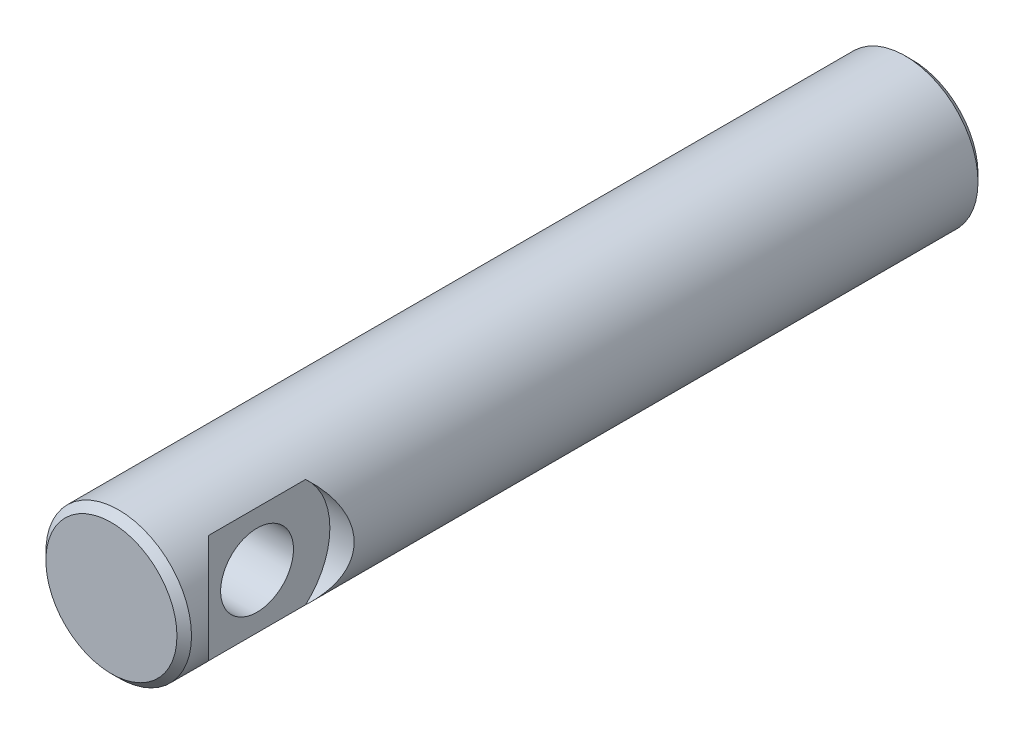
ISO-10303-21;
HEADER;
FILE_DESCRIPTION(('STEP AP214'),'2;1');
FILE_NAME('part.step','',(''),(''),'','','');
FILE_SCHEMA(('AUTOMOTIVE_DESIGN { 1 0 10303 214 1 1 1 1 }'));
ENDSEC;
DATA;
#1=APPLICATION_CONTEXT('core data for automotive mechanical design processes');
#2=APPLICATION_PROTOCOL_DEFINITION('international standard','automotive_design',2000,#1);
#3=PRODUCT_CONTEXT('',#1,'mechanical');
#4=PRODUCT('Part','Part','',(#3));
#5=PRODUCT_RELATED_PRODUCT_CATEGORY('part','',(#4));
#6=PRODUCT_DEFINITION_FORMATION('','',#4);
#7=PRODUCT_DEFINITION_CONTEXT('part definition',#1,'design');
#8=PRODUCT_DEFINITION('design','',#6,#7);
#9=PRODUCT_DEFINITION_SHAPE('','',#8);
#10=(LENGTH_UNIT() NAMED_UNIT(*) SI_UNIT(.MILLI.,.METRE.));
#11=(NAMED_UNIT(*) PLANE_ANGLE_UNIT() SI_UNIT($,.RADIAN.));
#12=(NAMED_UNIT(*) SI_UNIT($,.STERADIAN.) SOLID_ANGLE_UNIT());
#13=UNCERTAINTY_MEASURE_WITH_UNIT(LENGTH_MEASURE(1.E-05),#10,'distance_accuracy_value','');
#14=(GEOMETRIC_REPRESENTATION_CONTEXT(3) GLOBAL_UNCERTAINTY_ASSIGNED_CONTEXT((#13)) GLOBAL_UNIT_ASSIGNED_CONTEXT((#10,
#11,#12)) REPRESENTATION_CONTEXT('',''));
#15=CARTESIAN_POINT('',(0.,0.,0.));
#16=DIRECTION('',(0.,0.,1.));
#17=DIRECTION('',(1.,0.,0.));
#18=AXIS2_PLACEMENT_3D('',#15,#16,#17);
#19=CARTESIAN_POINT('',(0.,0.,-33.));
#20=DIRECTION('',(0.,0.,1.));
#21=DIRECTION('',(-1.,0.,0.));
#22=AXIS2_PLACEMENT_3D('',#19,#20,#21);
#23=CYLINDRICAL_SURFACE('',#22,3.);
#24=CARTESIAN_POINT('',(0.,0.,-0.300000000000002));
#25=DIRECTION('',(0.,0.,1.));
#26=DIRECTION('',(1.,0.,0.));
#27=AXIS2_PLACEMENT_3D('',#24,#25,#26);
#28=CIRCLE('',#27,3.);
#29=CARTESIAN_POINT('',(3.,0.,-0.300000000000002));
#30=VERTEX_POINT('',#29);
#31=EDGE_CURVE('E80',#30,#30,#28,.T.);
#32=ORIENTED_EDGE('',*,*,#31,.F.);
#33=EDGE_LOOP('',(#32));
#34=FACE_BOUND('',#33,.T.);
#35=CARTESIAN_POINT('',(0.,0.,-32.7));
#36=DIRECTION('',(0.,0.,1.));
#37=DIRECTION('',(1.,0.,0.));
#38=AXIS2_PLACEMENT_3D('',#35,#36,#37);
#39=CIRCLE('',#38,3.);
#40=CARTESIAN_POINT('',(3.,0.,-32.7));
#41=VERTEX_POINT('',#40);
#42=EDGE_CURVE('E77',#41,#41,#39,.F.);
#43=ORIENTED_EDGE('',*,*,#42,.F.);
#44=EDGE_LOOP('',(#43));
#45=FACE_BOUND('',#44,.T.);
#46=CARTESIAN_POINT('',(0.,0.,-4.00000000000001));
#47=DIRECTION('',(0.707106781186548,0.,-0.707106781186547));
#48=DIRECTION('',(0.707106781186547,0.,0.707106781186548));
#49=AXIS2_PLACEMENT_3D('',#46,#47,#48);
#50=ELLIPSE('',#49,4.24264068711929,3.);
#51=CARTESIAN_POINT('',(2.,-2.2360679774998,-2.00000000000001));
#52=VERTEX_POINT('',#51);
#53=CARTESIAN_POINT('',(2.,2.2360679774998,-2.00000000000001));
#54=VERTEX_POINT('',#53);
#55=EDGE_CURVE('E64',#52,#54,#50,.F.);
#56=ORIENTED_EDGE('',*,*,#55,.T.);
#57=DIRECTION('',(0.,0.,1.));
#58=VECTOR('',#57,1.);
#59=CARTESIAN_POINT('',(2.00000000000002,2.23606797749977,-33.));
#60=LINE('',#59,#58);
#61=CARTESIAN_POINT('',(2.,2.23606797749979,-6.00000000000001));
#62=VERTEX_POINT('',#61);
#63=EDGE_CURVE('E69',#54,#62,#60,.F.);
#64=ORIENTED_EDGE('',*,*,#63,.T.);
#65=CARTESIAN_POINT('',(0.,0.,-4.00000000000001));
#66=DIRECTION('',(-0.707106781186547,0.,-0.707106781186548));
#67=DIRECTION('',(-0.707106781186548,0.,0.707106781186547));
#68=AXIS2_PLACEMENT_3D('',#65,#66,#67);
#69=ELLIPSE('',#68,4.24264068711929,3.);
#70=CARTESIAN_POINT('',(2.,-2.23606797749979,-6.00000000000001));
#71=VERTEX_POINT('',#70);
#72=EDGE_CURVE('E74',#62,#71,#69,.T.);
#73=ORIENTED_EDGE('',*,*,#72,.T.);
#74=DIRECTION('',(0.,0.,1.));
#75=VECTOR('',#74,1.);
#76=CARTESIAN_POINT('',(2.00000000000002,-2.23606797749977,-33.));
#77=LINE('',#76,#75);
#78=EDGE_CURVE('E73',#71,#52,#77,.T.);
#79=ORIENTED_EDGE('',*,*,#78,.T.);
#80=EDGE_LOOP('',(#56,#64,#73,#79));
#81=FACE_BOUND('',#80,.T.);
#82=CARTESIAN_POINT('',(-3.,0.,-5.50000000000002));
#83=CARTESIAN_POINT('',(-2.99999570107562,0.0788579444268507,-5.49999504652423));
#84=CARTESIAN_POINT('',(-2.99685736529635,0.157809899546345,-5.49374489031844));
#85=CARTESIAN_POINT('',(-2.98461234055735,0.313380352903346,-5.46902067948771));
#86=CARTESIAN_POINT('',(-2.97549431743379,0.389994130070447,-5.4505234105033));
#87=CARTESIAN_POINT('',(-2.95224419105063,0.538400317320677,-5.40220928707508));
#88=CARTESIAN_POINT('',(-2.93813158766306,0.610210204408723,-5.37243642362807));
#89=CARTESIAN_POINT('',(-2.90618664773642,0.747708925209902,-5.30264406795254));
#90=CARTESIAN_POINT('',(-2.88835460450288,0.813398240985093,-5.26262538362672));
#91=CARTESIAN_POINT('',(-2.84934387387093,0.941261726642869,-5.17072412577209));
#92=CARTESIAN_POINT('',(-2.82802798691305,1.00298281668317,-5.11827028114056));
#93=CARTESIAN_POINT('',(-2.78489955370114,1.11716916730048,-5.00421778112946));
#94=CARTESIAN_POINT('',(-2.76308664313552,1.16962737466016,-4.94261222234136));
#95=CARTESIAN_POINT('',(-2.71948426796021,1.26787800067542,-4.80627497571495));
#96=CARTESIAN_POINT('',(-2.69782780455197,1.31283800332746,-4.73089585248115));
#97=CARTESIAN_POINT('',(-2.6592896815848,1.38925234033605,-4.57244899602069));
#98=CARTESIAN_POINT('',(-2.64240461410484,1.42071632244951,-4.48938680691589));
#99=CARTESIAN_POINT('',(-2.61686800556712,1.46719866328289,-4.32300234186713));
#100=CARTESIAN_POINT('',(-2.6077840737557,1.48308878562067,-4.23999332189892));
#101=CARTESIAN_POINT('',(-2.59772834922791,1.50064048996328,-4.0720317433308));
#102=CARTESIAN_POINT('',(-2.59674854014931,1.50231613255962,-3.98708118869328));
#103=CARTESIAN_POINT('',(-2.60266395385872,1.49203093075845,-3.82857096352696));
#104=CARTESIAN_POINT('',(-2.6086314549302,1.48167683930524,-3.75486395316543));
#105=CARTESIAN_POINT('',(-2.62614343100775,1.45040977358541,-3.61041713594045));
#106=CARTESIAN_POINT('',(-2.63768968247664,1.42949343584649,-3.53967828204203));
#107=CARTESIAN_POINT('',(-2.66531214619111,1.37731467057902,-3.40115630115152));
#108=CARTESIAN_POINT('',(-2.68148760995997,1.345822600674,-3.33348040182132));
#109=CARTESIAN_POINT('',(-2.71655106422105,1.27356253150201,-3.20404856111499));
#110=CARTESIAN_POINT('',(-2.73544027170285,1.23279036571871,-3.14229529659987));
#111=CARTESIAN_POINT('',(-2.77669736854928,1.13709908236919,-3.01821812088517));
#112=CARTESIAN_POINT('',(-2.79920265355119,1.08104168755393,-2.95681468963577));
#113=CARTESIAN_POINT('',(-2.8432143495061,0.959333368112069,-2.84389687211365));
#114=CARTESIAN_POINT('',(-2.86472027938201,0.893677884861437,-2.79238721194918));
#115=CARTESIAN_POINT('',(-2.90552980924446,0.750774758747781,-2.69847150845541));
#116=CARTESIAN_POINT('',(-2.92468476243011,0.673130387399121,-2.65659929133139));
#117=CARTESIAN_POINT('',(-2.95736821681863,0.510699323233201,-2.58685445643549));
#118=CARTESIAN_POINT('',(-2.9709011841533,0.425918364397919,-2.55897072247725));
#119=CARTESIAN_POINT('',(-2.98986500612153,0.259149737491058,-2.52028689442499));
#120=CARTESIAN_POINT('',(-2.99587407451965,0.177512295822493,-2.50826314637983));
#121=CARTESIAN_POINT('',(-3.00109520188655,0.01316939992403,-2.49780290329827));
#122=CARTESIAN_POINT('',(-3.00031048081978,-0.0695355298048611,-2.4993599715408));
#123=CARTESIAN_POINT('',(-2.99236788380152,-0.226849457978979,-2.51531003262812));
#124=CARTESIAN_POINT('',(-2.98570868532252,-0.301589112074895,-2.52869879909499));
#125=CARTESIAN_POINT('',(-2.9673325697226,-0.447610338452912,-2.56635710784268));
#126=CARTESIAN_POINT('',(-2.95561509501618,-0.518891528536631,-2.59062784968024));
#127=CARTESIAN_POINT('',(-2.92776377120382,-0.658332912674361,-2.64999769964955));
#128=CARTESIAN_POINT('',(-2.91151322654446,-0.726345595508707,-2.68538657517443));
#129=CARTESIAN_POINT('',(-2.87615961476126,-0.85569204254891,-2.76566130346985));
#130=CARTESIAN_POINT('',(-2.85705533350407,-0.917022944664891,-2.81055120189309));
#131=CARTESIAN_POINT('',(-2.81562332004297,-1.03765153393383,-2.91364063799607));
#132=CARTESIAN_POINT('',(-2.79316327265249,-1.09615811672855,-2.97271430266772));
#133=CARTESIAN_POINT('',(-2.7489358741323,-1.20278448167829,-3.09988772691659));
#134=CARTESIAN_POINT('',(-2.7271690110007,-1.25089707856782,-3.16799367827188));
#135=CARTESIAN_POINT('',(-2.68576788309734,-1.33756187171853,-3.31546548125947));
#136=CARTESIAN_POINT('',(-2.66628794383591,-1.37553824370038,-3.39521689914172));
#137=CARTESIAN_POINT('',(-2.63361108441201,-1.43712423890206,-3.56126510136245));
#138=CARTESIAN_POINT('',(-2.62040607332624,-1.46075237380053,-3.64755328970034));
#139=CARTESIAN_POINT('',(-2.60342251538702,-1.49079253120032,-3.81536533432706));
#140=CARTESIAN_POINT('',(-2.59886075197597,-1.49863949460819,-3.89655138015287));
#141=CARTESIAN_POINT('',(-2.59748031962404,-1.50103373156431,-4.05917060074679));
#142=CARTESIAN_POINT('',(-2.60065829439584,-1.49558676993487,-4.1406036531068));
#143=CARTESIAN_POINT('',(-2.61356793076614,-1.47288918838998,-4.29322525230016));
#144=CARTESIAN_POINT('',(-2.62264641723987,-1.45681247151456,-4.36465070521712));
#145=CARTESIAN_POINT('',(-2.64556524281478,-1.41476303733663,-4.50371217913656));
#146=CARTESIAN_POINT('',(-2.65940711354502,-1.38878713673989,-4.57134697313806));
#147=CARTESIAN_POINT('',(-2.69142795546803,-1.32572361795086,-4.70593727647982));
#148=CARTESIAN_POINT('',(-2.7098358359388,-1.28800670672356,-4.77254185274355));
#149=CARTESIAN_POINT('',(-2.7485299745229,-1.2032264574561,-4.8989118042719));
#150=CARTESIAN_POINT('',(-2.76881720693415,-1.15615825686235,-4.95867359578168));
#151=CARTESIAN_POINT('',(-2.81193484737138,-1.04730498999207,-5.07721297353203));
#152=CARTESIAN_POINT('',(-2.83477474959942,-0.984426634495904,-5.13498865352545));
#153=CARTESIAN_POINT('',(-2.87816628389896,-0.849232209349807,-5.23939447515292));
#154=CARTESIAN_POINT('',(-2.89871667939292,-0.776911084957807,-5.28601860920488));
#155=CARTESIAN_POINT('',(-2.93547014349806,-0.623897395174429,-5.36685454406812));
#156=CARTESIAN_POINT('',(-2.95164144740899,-0.543149255665106,-5.40097625385472));
#157=CARTESIAN_POINT('',(-2.9775201194848,-0.376113151707138,-5.45471225163613));
#158=CARTESIAN_POINT('',(-2.98724585044602,-0.289841699383657,-5.47436777020859));
#159=CARTESIAN_POINT('',(-2.99543192870217,-0.168902919736348,-5.49084611662863));
#160=CARTESIAN_POINT('',(-2.99714048010376,-0.135242819162352,-5.49427396129953));
#161=CARTESIAN_POINT('',(-2.99942545465223,-0.0677275977076401,-5.49885199827115));
#162=CARTESIAN_POINT('',(-3.00000184655071,-0.033872471469944,-5.50000212770533));
#163=CARTESIAN_POINT('',(-3.,0.,-5.50000000000002));
#164=B_SPLINE_CURVE_WITH_KNOTS('',3,(#82,#83,#84,#85,#86,#87,#88,#89,#90,#91,#92,#93,#94,#95,
#96,#97,#98,#99,#100,#101,#102,#103,#104,#105,#106,#107,#108,#109,#110,#111,#112,#113,#114,#115,
#116,#117,#118,#119,#120,#121,#122,#123,#124,#125,#126,#127,#128,#129,#130,#131,#132,#133,#134,
#135,#136,#137,#138,#139,#140,#141,#142,#143,#144,#145,#146,#147,#148,#149,#150,#151,#152,#153,
#154,#155,#156,#157,#158,#159,#160,#161,#162,#163),.UNSPECIFIED.,.T.,.F.,(4,2,2,2,2,2,2,2,2,2,2,
2,2,2,2,2,2,2,2,2,2,2,2,2,2,2,2,2,2,2,2,2,2,2,2,2,2,2,2,2,4),(0.,0.23643638613044,
0.473322224563799,0.709293233238452,0.945245640872357,1.19547263807714,1.44588935648106,
1.7157258964613,1.98536921847423,2.23887018210346,2.49212035993532,2.71508568613983,
2.9381220588852,3.16635360252733,3.39468781890335,3.6519741200082,3.90938301898032,
4.17874533321664,4.44789325368422,4.69474935707022,4.94148846767217,5.16910359759186,
5.39674382446401,5.63089284041852,5.86514176122513,6.12239415966632,6.37982382923152,
6.64972023242593,6.91926767918181,7.16293961254575,7.40650589797023,7.62686895373289,
7.84730293182532,8.08254685170436,8.31791341715452,8.58187864135763,8.84598575071874,
9.11196020495296,9.3771736293173,9.47872920200882,9.58028757766606),.UNSPECIFIED.);
#165=CARTESIAN_POINT('',(-3.,0.,-5.50000000000002));
#166=VERTEX_POINT('',#165);
#167=EDGE_CURVE('E84',#166,#166,#164,.T.);
#168=ORIENTED_EDGE('',*,*,#167,.T.);
#169=EDGE_LOOP('',(#168));
#170=FACE_BOUND('',#169,.T.);
#171=ADVANCED_FACE('F35',(#34,#45,#81,#170),#23,.T.);
#172=CARTESIAN_POINT('',(0.,0.,-33.));
#173=DIRECTION('',(0.,0.,-1.));
#174=DIRECTION('',(1.,0.,0.));
#175=AXIS2_PLACEMENT_3D('',#172,#173,#174);
#176=PLANE('',#175);
#177=CARTESIAN_POINT('',(0.,0.,-33.));
#178=DIRECTION('',(0.,0.,1.));
#179=DIRECTION('',(1.,0.,0.));
#180=AXIS2_PLACEMENT_3D('',#177,#178,#179);
#181=CIRCLE('',#180,2.7);
#182=CARTESIAN_POINT('',(2.7,0.,-33.));
#183=VERTEX_POINT('',#182);
#184=EDGE_CURVE('E11',#183,#183,#181,.T.);
#185=ORIENTED_EDGE('',*,*,#184,.F.);
#186=EDGE_LOOP('',(#185));
#187=FACE_BOUND('',#186,.T.);
#188=ADVANCED_FACE('F99',(#187),#176,.T.);
#189=CARTESIAN_POINT('',(0.,0.,0.));
#190=DIRECTION('',(0.,0.,-1.));
#191=DIRECTION('',(1.,0.,0.));
#192=AXIS2_PLACEMENT_3D('',#189,#190,#191);
#193=PLANE('',#192);
#194=CARTESIAN_POINT('',(0.,0.,0.));
#195=DIRECTION('',(0.,0.,1.));
#196=DIRECTION('',(1.,0.,0.));
#197=AXIS2_PLACEMENT_3D('',#194,#195,#196);
#198=CIRCLE('',#197,2.7);
#199=CARTESIAN_POINT('',(2.7,0.,0.));
#200=VERTEX_POINT('',#199);
#201=EDGE_CURVE('E43',#200,#200,#198,.F.);
#202=ORIENTED_EDGE('',*,*,#201,.F.);
#203=EDGE_LOOP('',(#202));
#204=FACE_BOUND('',#203,.T.);
#205=ADVANCED_FACE('F101',(#204),#193,.F.);
#206=CARTESIAN_POINT('',(10.,0.,-4.));
#207=DIRECTION('',(-1.,0.,0.));
#208=DIRECTION('',(0.,0.,-1.));
#209=AXIS2_PLACEMENT_3D('',#206,#207,#208);
#210=CYLINDRICAL_SURFACE('',#209,1.50000000000001);
#211=CARTESIAN_POINT('',(2.,0.,-4.00000000000001));
#212=DIRECTION('',(1.,0.,0.));
#213=DIRECTION('',(0.,0.,-1.));
#214=AXIS2_PLACEMENT_3D('',#211,#212,#213);
#215=CIRCLE('',#214,1.50000000000001);
#216=CARTESIAN_POINT('',(2.,0.,-5.50000000000001));
#217=VERTEX_POINT('',#216);
#218=EDGE_CURVE('E66',#217,#217,#215,.T.);
#219=ORIENTED_EDGE('',*,*,#218,.T.);
#220=EDGE_LOOP('',(#219));
#221=FACE_BOUND('',#220,.T.);
#222=ORIENTED_EDGE('',*,*,#167,.F.);
#223=EDGE_LOOP('',(#222));
#224=FACE_BOUND('',#223,.T.);
#225=ADVANCED_FACE('F92',(#221,#224),#210,.F.);
#226=CARTESIAN_POINT('',(2.,0.,-2.5));
#227=DIRECTION('',(1.,0.,0.));
#228=DIRECTION('',(0.,0.,1.));
#229=AXIS2_PLACEMENT_3D('',#226,#227,#228);
#230=PLANE('',#229);
#231=ORIENTED_EDGE('',*,*,#218,.F.);
#232=EDGE_LOOP('',(#231));
#233=FACE_BOUND('',#232,.T.);
#234=ORIENTED_EDGE('',*,*,#78,.F.);
#235=CARTESIAN_POINT('',(2.,0.,-4.00000000000001));
#236=DIRECTION('',(1.,0.,0.));
#237=DIRECTION('',(0.,0.,-1.));
#238=AXIS2_PLACEMENT_3D('',#235,#236,#237);
#239=CIRCLE('',#238,3.00000000000001);
#240=EDGE_CURVE('E50',#71,#62,#239,.T.);
#241=ORIENTED_EDGE('',*,*,#240,.T.);
#242=ORIENTED_EDGE('',*,*,#63,.F.);
#243=EDGE_CURVE('E61',#54,#52,#239,.T.);
#244=ORIENTED_EDGE('',*,*,#243,.T.);
#245=EDGE_LOOP('',(#234,#241,#242,#244));
#246=FACE_BOUND('',#245,.T.);
#247=ADVANCED_FACE('F70',(#233,#246),#230,.T.);
#248=CARTESIAN_POINT('',(10.,0.,-4.));
#249=DIRECTION('',(-1.,0.,0.));
#250=DIRECTION('',(0.,0.,-1.));
#251=AXIS2_PLACEMENT_3D('',#248,#249,#250);
#252=CYLINDRICAL_SURFACE('',#251,3.);
#253=ORIENTED_EDGE('',*,*,#55,.F.);
#254=ORIENTED_EDGE('',*,*,#243,.F.);
#255=EDGE_LOOP('',(#253,#254));
#256=FACE_BOUND('',#255,.T.);
#257=ADVANCED_FACE('F62',(#256),#252,.F.);
#258=ORIENTED_EDGE('',*,*,#72,.F.);
#259=ORIENTED_EDGE('',*,*,#240,.F.);
#260=EDGE_LOOP('',(#258,#259));
#261=FACE_BOUND('',#260,.T.);
#262=ADVANCED_FACE('F104',(#261),#252,.F.);
#263=CARTESIAN_POINT('',(0.,0.,-0.300000000000002));
#264=DIRECTION('',(0.,0.,-1.));
#265=DIRECTION('',(1.,0.,0.));
#266=AXIS2_PLACEMENT_3D('',#263,#264,#265);
#267=CONICAL_SURFACE('',#266,3.,0.785398163397449);
#268=ORIENTED_EDGE('',*,*,#201,.T.);
#269=EDGE_LOOP('',(#268));
#270=FACE_BOUND('',#269,.T.);
#271=ORIENTED_EDGE('',*,*,#31,.T.);
#272=EDGE_LOOP('',(#271));
#273=FACE_BOUND('',#272,.T.);
#274=ADVANCED_FACE('F102',(#270,#273),#267,.T.);
#275=CARTESIAN_POINT('',(0.,0.,-33.));
#276=DIRECTION('',(0.,0.,1.));
#277=DIRECTION('',(-1.,0.,0.));
#278=AXIS2_PLACEMENT_3D('',#275,#276,#277);
#279=CONICAL_SURFACE('',#278,2.7,0.785398163397449);
#280=ORIENTED_EDGE('',*,*,#42,.T.);
#281=EDGE_LOOP('',(#280));
#282=FACE_BOUND('',#281,.T.);
#283=ORIENTED_EDGE('',*,*,#184,.T.);
#284=EDGE_LOOP('',(#283));
#285=FACE_BOUND('',#284,.T.);
#286=ADVANCED_FACE('F37',(#282,#285),#279,.T.);
#287=CLOSED_SHELL('',(#171,#188,#205,#225,#247,#257,#262,#274,#286));
#288=MANIFOLD_SOLID_BREP('B2',#287);
#289=ADVANCED_BREP_SHAPE_REPRESENTATION('',(#18,#288),#14);
#290=SHAPE_DEFINITION_REPRESENTATION(#9,#289);
ENDSEC;
END-ISO-10303-21;
